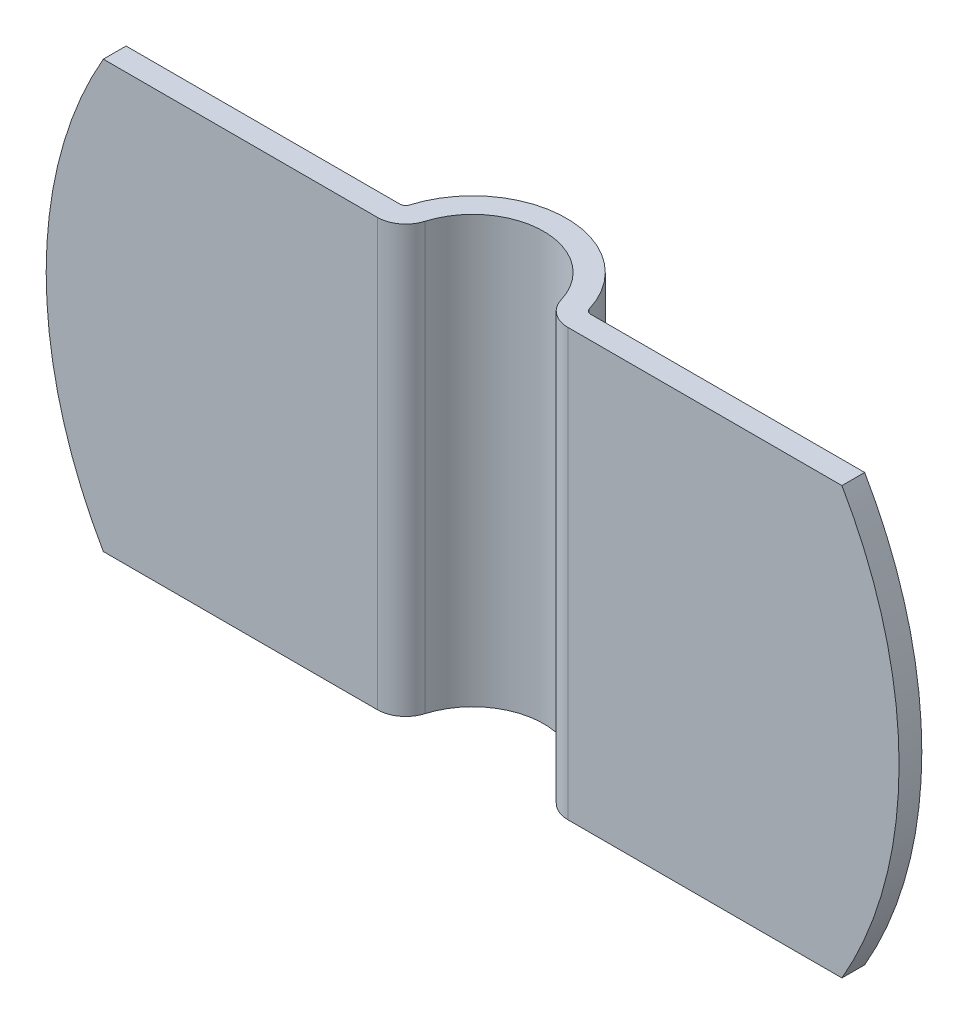
ISO-10303-21;
HEADER;
FILE_DESCRIPTION(('STEP AP214'),'2;1');
FILE_NAME('part.step','',(''),(''),'','','');
FILE_SCHEMA(('AUTOMOTIVE_DESIGN { 1 0 10303 214 1 1 1 1 }'));
ENDSEC;
DATA;
#1=APPLICATION_CONTEXT('core data for automotive mechanical design processes');
#2=APPLICATION_PROTOCOL_DEFINITION('international standard','automotive_design',2000,#1);
#3=PRODUCT_CONTEXT('',#1,'mechanical');
#4=PRODUCT('Part','Part','',(#3));
#5=PRODUCT_RELATED_PRODUCT_CATEGORY('part','',(#4));
#6=PRODUCT_DEFINITION_FORMATION('','',#4);
#7=PRODUCT_DEFINITION_CONTEXT('part definition',#1,'design');
#8=PRODUCT_DEFINITION('design','',#6,#7);
#9=PRODUCT_DEFINITION_SHAPE('','',#8);
#10=(LENGTH_UNIT() NAMED_UNIT(*) SI_UNIT(.MILLI.,.METRE.));
#11=(NAMED_UNIT(*) PLANE_ANGLE_UNIT() SI_UNIT($,.RADIAN.));
#12=(NAMED_UNIT(*) SI_UNIT($,.STERADIAN.) SOLID_ANGLE_UNIT());
#13=UNCERTAINTY_MEASURE_WITH_UNIT(LENGTH_MEASURE(1.E-05),#10,'distance_accuracy_value','');
#14=(GEOMETRIC_REPRESENTATION_CONTEXT(3) GLOBAL_UNCERTAINTY_ASSIGNED_CONTEXT((#13)) GLOBAL_UNIT_ASSIGNED_CONTEXT((#10,
#11,#12)) REPRESENTATION_CONTEXT('',''));
#15=CARTESIAN_POINT('',(0.,0.,0.));
#16=DIRECTION('',(0.,0.,1.));
#17=DIRECTION('',(1.,0.,0.));
#18=AXIS2_PLACEMENT_3D('',#15,#16,#17);
#19=CARTESIAN_POINT('',(0.670820393249937,3.,0.));
#20=DIRECTION('',(0.,0.,-1.));
#21=DIRECTION('',(-1.,0.,0.));
#22=AXIS2_PLACEMENT_3D('',#19,#20,#21);
#23=PLANE('',#22);
#24=CARTESIAN_POINT('',(0.,1.5,0.));
#25=DIRECTION('',(0.,0.,1.));
#26=DIRECTION('',(1.,0.,0.));
#27=AXIS2_PLACEMENT_3D('',#24,#25,#26);
#28=CIRCLE('',#27,3.);
#29=CARTESIAN_POINT('',(2.59807621135332,0.,0.));
#30=VERTEX_POINT('',#29);
#31=CARTESIAN_POINT('',(2.59807621135332,3.,0.));
#32=VERTEX_POINT('',#31);
#33=EDGE_CURVE('E54',#30,#32,#28,.T.);
#34=ORIENTED_EDGE('',*,*,#33,.T.);
#35=DIRECTION('',(1.,0.,0.));
#36=VECTOR('',#35,1.);
#37=CARTESIAN_POINT('',(0.670820393249937,3.,0.));
#38=LINE('',#37,#36);
#39=CARTESIAN_POINT('',(0.670820393249937,3.,0.));
#40=VERTEX_POINT('',#39);
#41=EDGE_CURVE('E123',#40,#32,#38,.T.);
#42=ORIENTED_EDGE('',*,*,#41,.F.);
#43=DIRECTION('',(0.,-1.,0.));
#44=VECTOR('',#43,1.);
#45=CARTESIAN_POINT('',(0.670820393249937,3.,0.));
#46=LINE('',#45,#44);
#47=CARTESIAN_POINT('',(0.670820393249937,0.,0.));
#48=VERTEX_POINT('',#47);
#49=EDGE_CURVE('E170',#40,#48,#46,.T.);
#50=ORIENTED_EDGE('',*,*,#49,.T.);
#51=DIRECTION('',(1.,0.,0.));
#52=VECTOR('',#51,1.);
#53=CARTESIAN_POINT('',(0.670820393249937,0.,0.));
#54=LINE('',#53,#52);
#55=EDGE_CURVE('E125',#48,#30,#54,.T.);
#56=ORIENTED_EDGE('',*,*,#55,.T.);
#57=EDGE_LOOP('',(#34,#42,#50,#56));
#58=FACE_BOUND('',#57,.T.);
#59=ADVANCED_FACE('F33',(#58),#23,.F.);
#60=CARTESIAN_POINT('',(0.670820393249937,3.,-0.16));
#61=DIRECTION('',(0.,0.,-1.));
#62=DIRECTION('',(-1.,0.,0.));
#63=AXIS2_PLACEMENT_3D('',#60,#61,#62);
#64=PLANE('',#63);
#65=DIRECTION('',(1.,0.,0.));
#66=VECTOR('',#65,1.);
#67=CARTESIAN_POINT('',(0.670820393249937,3.,-0.16));
#68=LINE('',#67,#66);
#69=CARTESIAN_POINT('',(0.670820393249937,3.,-0.16));
#70=VERTEX_POINT('',#69);
#71=CARTESIAN_POINT('',(2.59807621135331,3.,-0.16));
#72=VERTEX_POINT('',#71);
#73=EDGE_CURVE('E142',#70,#72,#68,.T.);
#74=ORIENTED_EDGE('',*,*,#73,.T.);
#75=CARTESIAN_POINT('',(0.,1.5,-0.16));
#76=DIRECTION('',(0.,0.,-1.));
#77=DIRECTION('',(-1.,0.,0.));
#78=AXIS2_PLACEMENT_3D('',#75,#76,#77);
#79=CIRCLE('',#78,3.);
#80=CARTESIAN_POINT('',(2.59807621135332,0.,-0.16));
#81=VERTEX_POINT('',#80);
#82=EDGE_CURVE('E132',#72,#81,#79,.T.);
#83=ORIENTED_EDGE('',*,*,#82,.T.);
#84=DIRECTION('',(1.,0.,0.));
#85=VECTOR('',#84,1.);
#86=CARTESIAN_POINT('',(0.670820393249937,0.,-0.16));
#87=LINE('',#86,#85);
#88=CARTESIAN_POINT('',(0.670820393249937,0.,-0.16));
#89=VERTEX_POINT('',#88);
#90=EDGE_CURVE('E172',#89,#81,#87,.T.);
#91=ORIENTED_EDGE('',*,*,#90,.F.);
#92=DIRECTION('',(0.,-1.,0.));
#93=VECTOR('',#92,1.);
#94=CARTESIAN_POINT('',(0.670820393249937,3.,-0.16));
#95=LINE('',#94,#93);
#96=EDGE_CURVE('E208',#70,#89,#95,.T.);
#97=ORIENTED_EDGE('',*,*,#96,.F.);
#98=EDGE_LOOP('',(#74,#83,#91,#97));
#99=FACE_BOUND('',#98,.T.);
#100=ADVANCED_FACE('F212',(#99),#64,.T.);
#101=CARTESIAN_POINT('',(-3.,3.,-0.16));
#102=DIRECTION('',(0.,0.,-1.));
#103=DIRECTION('',(-1.,0.,0.));
#104=AXIS2_PLACEMENT_3D('',#101,#102,#103);
#105=PLANE('',#104);
#106=DIRECTION('',(1.,0.,0.));
#107=VECTOR('',#106,1.);
#108=CARTESIAN_POINT('',(-3.,0.,-0.16));
#109=LINE('',#108,#107);
#110=CARTESIAN_POINT('',(-2.59807621135332,0.,-0.16));
#111=VERTEX_POINT('',#110);
#112=CARTESIAN_POINT('',(-0.670820393249937,0.,-0.16));
#113=VERTEX_POINT('',#112);
#114=EDGE_CURVE('E184',#111,#113,#109,.T.);
#115=ORIENTED_EDGE('',*,*,#114,.F.);
#116=CARTESIAN_POINT('',(0.,1.5,-0.16));
#117=DIRECTION('',(0.,0.,-1.));
#118=DIRECTION('',(-1.,0.,0.));
#119=AXIS2_PLACEMENT_3D('',#116,#117,#118);
#120=CIRCLE('',#119,3.);
#121=CARTESIAN_POINT('',(-2.59807621135331,3.,-0.16));
#122=VERTEX_POINT('',#121);
#123=EDGE_CURVE('E46',#111,#122,#120,.T.);
#124=ORIENTED_EDGE('',*,*,#123,.T.);
#125=DIRECTION('',(1.,0.,0.));
#126=VECTOR('',#125,1.);
#127=CARTESIAN_POINT('',(-3.,3.,-0.16));
#128=LINE('',#127,#126);
#129=CARTESIAN_POINT('',(-0.670820393249937,3.,-0.16));
#130=VERTEX_POINT('',#129);
#131=EDGE_CURVE('E161',#122,#130,#128,.T.);
#132=ORIENTED_EDGE('',*,*,#131,.T.);
#133=DIRECTION('',(0.,-1.,0.));
#134=VECTOR('',#133,1.);
#135=CARTESIAN_POINT('',(-0.670820393249937,3.,-0.16));
#136=LINE('',#135,#134);
#137=EDGE_CURVE('E201',#130,#113,#136,.T.);
#138=ORIENTED_EDGE('',*,*,#137,.T.);
#139=EDGE_LOOP('',(#115,#124,#132,#138));
#140=FACE_BOUND('',#139,.T.);
#141=ADVANCED_FACE('F232',(#140),#105,.T.);
#142=CARTESIAN_POINT('',(-3.,3.,0.));
#143=DIRECTION('',(0.,0.,-1.));
#144=DIRECTION('',(-1.,0.,0.));
#145=AXIS2_PLACEMENT_3D('',#142,#143,#144);
#146=PLANE('',#145);
#147=CARTESIAN_POINT('',(-2.59807621135332,3.,0.));
#148=VERTEX_POINT('',#147);
#149=CARTESIAN_POINT('',(-2.59807621135332,0.,0.));
#150=VERTEX_POINT('',#149);
#151=EDGE_CURVE('E126',#148,#150,#28,.T.);
#152=ORIENTED_EDGE('',*,*,#151,.T.);
#153=DIRECTION('',(1.,0.,0.));
#154=VECTOR('',#153,1.);
#155=CARTESIAN_POINT('',(-3.,0.,0.));
#156=LINE('',#155,#154);
#157=CARTESIAN_POINT('',(-0.670820393249937,0.,0.));
#158=VERTEX_POINT('',#157);
#159=EDGE_CURVE('E186',#150,#158,#156,.T.);
#160=ORIENTED_EDGE('',*,*,#159,.T.);
#161=DIRECTION('',(0.,-1.,0.));
#162=VECTOR('',#161,1.);
#163=CARTESIAN_POINT('',(-0.670820393249937,3.,0.));
#164=LINE('',#163,#162);
#165=CARTESIAN_POINT('',(-0.670820393249937,3.,0.));
#166=VERTEX_POINT('',#165);
#167=EDGE_CURVE('E198',#166,#158,#164,.T.);
#168=ORIENTED_EDGE('',*,*,#167,.F.);
#169=DIRECTION('',(1.,0.,0.));
#170=VECTOR('',#169,1.);
#171=CARTESIAN_POINT('',(-3.,3.,0.));
#172=LINE('',#171,#170);
#173=EDGE_CURVE('E163',#148,#166,#172,.T.);
#174=ORIENTED_EDGE('',*,*,#173,.F.);
#175=EDGE_LOOP('',(#152,#160,#168,#174));
#176=FACE_BOUND('',#175,.T.);
#177=ADVANCED_FACE('F237',(#176),#146,.F.);
#178=CARTESIAN_POINT('',(0.670820393249937,3.,-0.2));
#179=DIRECTION('',(0.,1.,0.));
#180=DIRECTION('',(0.,0.,1.));
#181=AXIS2_PLACEMENT_3D('',#178,#179,#180);
#182=PLANE('',#181);
#183=ORIENTED_EDGE('',*,*,#131,.F.);
#184=DIRECTION('',(0.,0.,1.));
#185=VECTOR('',#184,1.);
#186=CARTESIAN_POINT('',(-2.59807621135332,3.,-0.66));
#187=LINE('',#186,#185);
#188=EDGE_CURVE('E150',#122,#148,#187,.T.);
#189=ORIENTED_EDGE('',*,*,#188,.T.);
#190=ORIENTED_EDGE('',*,*,#173,.T.);
#191=CARTESIAN_POINT('',(-0.670820393249937,3.,-0.2));
#192=DIRECTION('',(0.,1.,0.));
#193=DIRECTION('',(0.,0.,1.));
#194=AXIS2_PLACEMENT_3D('',#191,#192,#193);
#195=CIRCLE('',#194,0.2);
#196=CARTESIAN_POINT('',(-0.479157423749955,3.,-0.142857142857143));
#197=VERTEX_POINT('',#196);
#198=EDGE_CURVE('E165',#166,#197,#195,.T.);
#199=ORIENTED_EDGE('',*,*,#198,.T.);
#200=CARTESIAN_POINT('',(0.,3.,0.));
#201=DIRECTION('',(0.,-1.,0.));
#202=DIRECTION('',(0.,0.,-1.));
#203=AXIS2_PLACEMENT_3D('',#200,#201,#202);
#204=CIRCLE('',#203,0.5);
#205=CARTESIAN_POINT('',(0.479157423749955,3.,-0.142857142857143));
#206=VERTEX_POINT('',#205);
#207=EDGE_CURVE('E167',#197,#206,#204,.T.);
#208=ORIENTED_EDGE('',*,*,#207,.T.);
#209=CARTESIAN_POINT('',(0.670820393249937,3.,-0.2));
#210=DIRECTION('',(0.,1.,0.));
#211=DIRECTION('',(0.,0.,-1.));
#212=AXIS2_PLACEMENT_3D('',#209,#210,#211);
#213=CIRCLE('',#212,0.2);
#214=EDGE_CURVE('E140',#206,#40,#213,.T.);
#215=ORIENTED_EDGE('',*,*,#214,.T.);
#216=ORIENTED_EDGE('',*,*,#41,.T.);
#217=DIRECTION('',(0.,0.,1.));
#218=VECTOR('',#217,1.);
#219=CARTESIAN_POINT('',(2.59807621135332,3.,-0.66));
#220=LINE('',#219,#218);
#221=EDGE_CURVE('E129',#32,#72,#220,.F.);
#222=ORIENTED_EDGE('',*,*,#221,.T.);
#223=ORIENTED_EDGE('',*,*,#73,.F.);
#224=CARTESIAN_POINT('',(0.670820393249937,3.,-0.2));
#225=DIRECTION('',(0.,1.,0.));
#226=DIRECTION('',(1.,0.,0.));
#227=AXIS2_PLACEMENT_3D('',#224,#225,#226);
#228=CIRCLE('',#227,0.04);
#229=CARTESIAN_POINT('',(0.632487799349941,3.,-0.188571428571429));
#230=VERTEX_POINT('',#229);
#231=EDGE_CURVE('E145',#230,#70,#228,.T.);
#232=ORIENTED_EDGE('',*,*,#231,.F.);
#233=CARTESIAN_POINT('',(0.,3.,0.));
#234=DIRECTION('',(0.,1.,0.));
#235=DIRECTION('',(1.,0.,0.));
#236=AXIS2_PLACEMENT_3D('',#233,#234,#235);
#237=CIRCLE('',#236,0.66);
#238=CARTESIAN_POINT('',(-0.632487799349941,3.,-0.188571428571429));
#239=VERTEX_POINT('',#238);
#240=EDGE_CURVE('E155',#239,#230,#237,.F.);
#241=ORIENTED_EDGE('',*,*,#240,.F.);
#242=CARTESIAN_POINT('',(-0.670820393249937,3.,-0.2));
#243=DIRECTION('',(0.,1.,0.));
#244=DIRECTION('',(1.,0.,0.));
#245=AXIS2_PLACEMENT_3D('',#242,#243,#244);
#246=CIRCLE('',#245,0.04);
#247=EDGE_CURVE('E158',#130,#239,#246,.T.);
#248=ORIENTED_EDGE('',*,*,#247,.F.);
#249=EDGE_LOOP('',(#183,#189,#190,#199,#208,#215,#216,#222,#223,#232,#241,#248));
#250=FACE_BOUND('',#249,.T.);
#251=ADVANCED_FACE('F138',(#250),#182,.T.);
#252=CARTESIAN_POINT('',(0.670820393249937,0.,-0.2));
#253=DIRECTION('',(0.,1.,0.));
#254=DIRECTION('',(0.,0.,1.));
#255=AXIS2_PLACEMENT_3D('',#252,#253,#254);
#256=PLANE('',#255);
#257=DIRECTION('',(0.,0.,1.));
#258=VECTOR('',#257,1.);
#259=CARTESIAN_POINT('',(-2.59807621135332,0.,-0.66));
#260=LINE('',#259,#258);
#261=EDGE_CURVE('E12',#111,#150,#260,.T.);
#262=ORIENTED_EDGE('',*,*,#261,.F.);
#263=ORIENTED_EDGE('',*,*,#114,.T.);
#264=CARTESIAN_POINT('',(-0.670820393249937,0.,-0.2));
#265=DIRECTION('',(0.,1.,0.));
#266=DIRECTION('',(1.,0.,0.));
#267=AXIS2_PLACEMENT_3D('',#264,#265,#266);
#268=CIRCLE('',#267,0.04);
#269=CARTESIAN_POINT('',(-0.632487799349941,0.,-0.188571428571429));
#270=VERTEX_POINT('',#269);
#271=EDGE_CURVE('E181',#113,#270,#268,.T.);
#272=ORIENTED_EDGE('',*,*,#271,.T.);
#273=CARTESIAN_POINT('',(0.,0.,0.));
#274=DIRECTION('',(0.,1.,0.));
#275=DIRECTION('',(1.,0.,0.));
#276=AXIS2_PLACEMENT_3D('',#273,#274,#275);
#277=CIRCLE('',#276,0.66);
#278=CARTESIAN_POINT('',(0.632487799349941,0.,-0.188571428571429));
#279=VERTEX_POINT('',#278);
#280=EDGE_CURVE('E178',#270,#279,#277,.F.);
#281=ORIENTED_EDGE('',*,*,#280,.T.);
#282=CARTESIAN_POINT('',(0.670820393249937,0.,-0.2));
#283=DIRECTION('',(0.,1.,0.));
#284=DIRECTION('',(1.,0.,0.));
#285=AXIS2_PLACEMENT_3D('',#282,#283,#284);
#286=CIRCLE('',#285,0.04);
#287=EDGE_CURVE('E175',#279,#89,#286,.T.);
#288=ORIENTED_EDGE('',*,*,#287,.T.);
#289=ORIENTED_EDGE('',*,*,#90,.T.);
#290=DIRECTION('',(0.,0.,1.));
#291=VECTOR('',#290,1.);
#292=CARTESIAN_POINT('',(2.59807621135332,0.,-0.66));
#293=LINE('',#292,#291);
#294=EDGE_CURVE('E40',#30,#81,#293,.F.);
#295=ORIENTED_EDGE('',*,*,#294,.F.);
#296=ORIENTED_EDGE('',*,*,#55,.F.);
#297=CARTESIAN_POINT('',(0.670820393249937,0.,-0.2));
#298=DIRECTION('',(0.,1.,0.));
#299=DIRECTION('',(0.,0.,-1.));
#300=AXIS2_PLACEMENT_3D('',#297,#298,#299);
#301=CIRCLE('',#300,0.2);
#302=CARTESIAN_POINT('',(0.479157423749955,0.,-0.142857142857143));
#303=VERTEX_POINT('',#302);
#304=EDGE_CURVE('E143',#303,#48,#301,.T.);
#305=ORIENTED_EDGE('',*,*,#304,.F.);
#306=CARTESIAN_POINT('',(0.,0.,0.));
#307=DIRECTION('',(0.,-1.,0.));
#308=DIRECTION('',(0.,0.,-1.));
#309=AXIS2_PLACEMENT_3D('',#306,#307,#308);
#310=CIRCLE('',#309,0.5);
#311=CARTESIAN_POINT('',(-0.479157423749955,0.,-0.142857142857143));
#312=VERTEX_POINT('',#311);
#313=EDGE_CURVE('E147',#312,#303,#310,.T.);
#314=ORIENTED_EDGE('',*,*,#313,.F.);
#315=CARTESIAN_POINT('',(-0.670820393249937,0.,-0.2));
#316=DIRECTION('',(0.,1.,0.));
#317=DIRECTION('',(0.,0.,1.));
#318=AXIS2_PLACEMENT_3D('',#315,#316,#317);
#319=CIRCLE('',#318,0.2);
#320=EDGE_CURVE('E188',#158,#312,#319,.T.);
#321=ORIENTED_EDGE('',*,*,#320,.F.);
#322=ORIENTED_EDGE('',*,*,#159,.F.);
#323=EDGE_LOOP('',(#262,#263,#272,#281,#288,#289,#295,#296,#305,#314,#321,#322));
#324=FACE_BOUND('',#323,.T.);
#325=ADVANCED_FACE('F214',(#324),#256,.F.);
#326=CARTESIAN_POINT('',(0.670820393249937,3.,-0.2));
#327=DIRECTION('',(0.,-1.,0.));
#328=DIRECTION('',(0.,0.,-1.));
#329=AXIS2_PLACEMENT_3D('',#326,#327,#328);
#330=CYLINDRICAL_SURFACE('',#329,0.04);
#331=ORIENTED_EDGE('',*,*,#287,.F.);
#332=DIRECTION('',(0.,-1.,0.));
#333=VECTOR('',#332,1.);
#334=CARTESIAN_POINT('',(0.632487799349941,3.,-0.188571428571429));
#335=LINE('',#334,#333);
#336=EDGE_CURVE('E206',#230,#279,#335,.T.);
#337=ORIENTED_EDGE('',*,*,#336,.F.);
#338=ORIENTED_EDGE('',*,*,#231,.T.);
#339=ORIENTED_EDGE('',*,*,#96,.T.);
#340=EDGE_LOOP('',(#331,#337,#338,#339));
#341=FACE_BOUND('',#340,.T.);
#342=ADVANCED_FACE('F218',(#341),#330,.F.);
#343=CARTESIAN_POINT('',(0.,3.,0.));
#344=DIRECTION('',(0.,-1.,0.));
#345=DIRECTION('',(0.,0.,-1.));
#346=AXIS2_PLACEMENT_3D('',#343,#344,#345);
#347=CYLINDRICAL_SURFACE('',#346,0.66);
#348=ORIENTED_EDGE('',*,*,#280,.F.);
#349=DIRECTION('',(0.,-1.,0.));
#350=VECTOR('',#349,1.);
#351=CARTESIAN_POINT('',(-0.632487799349941,3.,-0.188571428571429));
#352=LINE('',#351,#350);
#353=EDGE_CURVE('E204',#239,#270,#352,.T.);
#354=ORIENTED_EDGE('',*,*,#353,.F.);
#355=ORIENTED_EDGE('',*,*,#240,.T.);
#356=ORIENTED_EDGE('',*,*,#336,.T.);
#357=EDGE_LOOP('',(#348,#354,#355,#356));
#358=FACE_BOUND('',#357,.T.);
#359=ADVANCED_FACE('F223',(#358),#347,.T.);
#360=CARTESIAN_POINT('',(-0.670820393249937,3.,-0.2));
#361=DIRECTION('',(0.,-1.,0.));
#362=DIRECTION('',(0.,0.,-1.));
#363=AXIS2_PLACEMENT_3D('',#360,#361,#362);
#364=CYLINDRICAL_SURFACE('',#363,0.04);
#365=ORIENTED_EDGE('',*,*,#271,.F.);
#366=ORIENTED_EDGE('',*,*,#137,.F.);
#367=ORIENTED_EDGE('',*,*,#247,.T.);
#368=ORIENTED_EDGE('',*,*,#353,.T.);
#369=EDGE_LOOP('',(#365,#366,#367,#368));
#370=FACE_BOUND('',#369,.T.);
#371=ADVANCED_FACE('F226',(#370),#364,.F.);
#372=CARTESIAN_POINT('',(-0.670820393249937,3.,-0.2));
#373=DIRECTION('',(0.,-1.,0.));
#374=DIRECTION('',(0.,0.,-1.));
#375=AXIS2_PLACEMENT_3D('',#372,#373,#374);
#376=CYLINDRICAL_SURFACE('',#375,0.2);
#377=ORIENTED_EDGE('',*,*,#320,.T.);
#378=DIRECTION('',(0.,-1.,0.));
#379=VECTOR('',#378,1.);
#380=CARTESIAN_POINT('',(-0.479157423749955,3.,-0.142857142857143));
#381=LINE('',#380,#379);
#382=EDGE_CURVE('E195',#197,#312,#381,.T.);
#383=ORIENTED_EDGE('',*,*,#382,.F.);
#384=ORIENTED_EDGE('',*,*,#198,.F.);
#385=ORIENTED_EDGE('',*,*,#167,.T.);
#386=EDGE_LOOP('',(#377,#383,#384,#385));
#387=FACE_BOUND('',#386,.T.);
#388=ADVANCED_FACE('F244',(#387),#376,.T.);
#389=CARTESIAN_POINT('',(0.,3.,0.));
#390=DIRECTION('',(0.,-1.,0.));
#391=DIRECTION('',(0.,0.,-1.));
#392=AXIS2_PLACEMENT_3D('',#389,#390,#391);
#393=CYLINDRICAL_SURFACE('',#392,0.5);
#394=ORIENTED_EDGE('',*,*,#313,.T.);
#395=DIRECTION('',(0.,-1.,0.));
#396=VECTOR('',#395,1.);
#397=CARTESIAN_POINT('',(0.479157423749955,3.,-0.142857142857143));
#398=LINE('',#397,#396);
#399=EDGE_CURVE('E192',#206,#303,#398,.T.);
#400=ORIENTED_EDGE('',*,*,#399,.F.);
#401=ORIENTED_EDGE('',*,*,#207,.F.);
#402=ORIENTED_EDGE('',*,*,#382,.T.);
#403=EDGE_LOOP('',(#394,#400,#401,#402));
#404=FACE_BOUND('',#403,.T.);
#405=ADVANCED_FACE('F247',(#404),#393,.F.);
#406=CARTESIAN_POINT('',(0.670820393249937,3.,-0.2));
#407=DIRECTION('',(0.,-1.,0.));
#408=DIRECTION('',(0.,0.,-1.));
#409=AXIS2_PLACEMENT_3D('',#406,#407,#408);
#410=CYLINDRICAL_SURFACE('',#409,0.2);
#411=ORIENTED_EDGE('',*,*,#304,.T.);
#412=ORIENTED_EDGE('',*,*,#49,.F.);
#413=ORIENTED_EDGE('',*,*,#214,.F.);
#414=ORIENTED_EDGE('',*,*,#399,.T.);
#415=EDGE_LOOP('',(#411,#412,#413,#414));
#416=FACE_BOUND('',#415,.T.);
#417=ADVANCED_FACE('F250',(#416),#410,.T.);
#418=CARTESIAN_POINT('',(0.,1.5,-0.66));
#419=DIRECTION('',(0.,0.,1.));
#420=DIRECTION('',(1.,0.,0.));
#421=AXIS2_PLACEMENT_3D('',#418,#419,#420);
#422=CYLINDRICAL_SURFACE('',#421,3.);
#423=ORIENTED_EDGE('',*,*,#82,.F.);
#424=ORIENTED_EDGE('',*,*,#221,.F.);
#425=ORIENTED_EDGE('',*,*,#33,.F.);
#426=ORIENTED_EDGE('',*,*,#294,.T.);
#427=EDGE_LOOP('',(#423,#424,#425,#426));
#428=FACE_BOUND('',#427,.T.);
#429=ADVANCED_FACE('F130',(#428),#422,.T.);
#430=ORIENTED_EDGE('',*,*,#123,.F.);
#431=ORIENTED_EDGE('',*,*,#261,.T.);
#432=ORIENTED_EDGE('',*,*,#151,.F.);
#433=ORIENTED_EDGE('',*,*,#188,.F.);
#434=EDGE_LOOP('',(#430,#431,#432,#433));
#435=FACE_BOUND('',#434,.T.);
#436=ADVANCED_FACE('F235',(#435),#422,.T.);
#437=CLOSED_SHELL('',(#59,#100,#141,#177,#251,#325,#342,#359,#371,#388,#405,#417,#429,#436));
#438=MANIFOLD_SOLID_BREP('B2',#437);
#439=ADVANCED_BREP_SHAPE_REPRESENTATION('',(#18,#438),#14);
#440=SHAPE_DEFINITION_REPRESENTATION(#9,#439);
ENDSEC;
END-ISO-10303-21;
